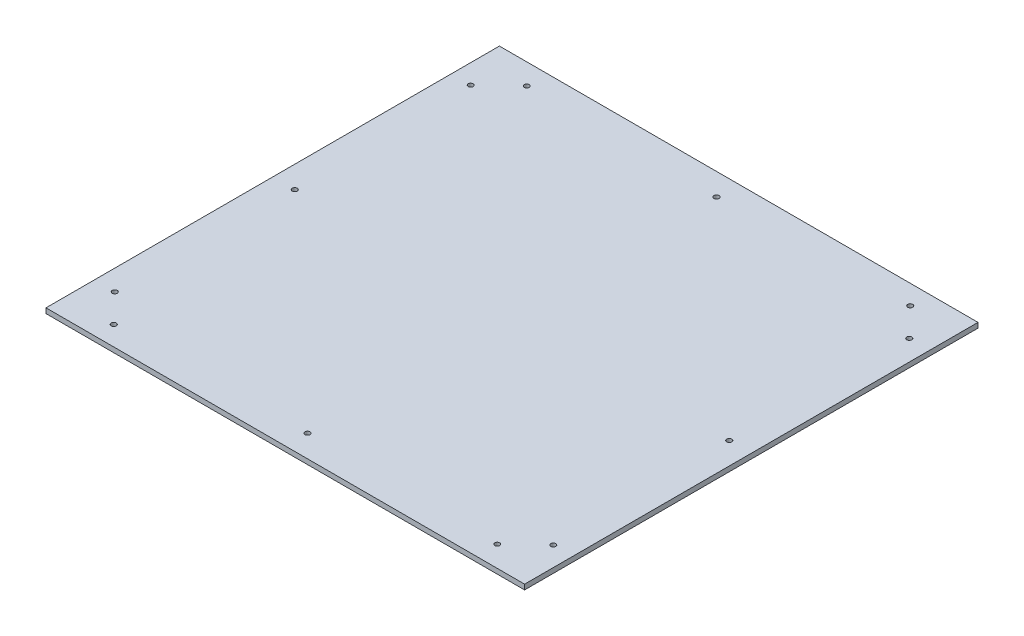
ISO-10303-21;
HEADER;
FILE_DESCRIPTION(('STEP AP214'),'2;1');
FILE_NAME('part.step','',(''),(''),'','','');
FILE_SCHEMA(('AUTOMOTIVE_DESIGN { 1 0 10303 214 1 1 1 1 }'));
ENDSEC;
DATA;
#1=APPLICATION_CONTEXT('core data for automotive mechanical design processes');
#2=APPLICATION_PROTOCOL_DEFINITION('international standard','automotive_design',2000,#1);
#3=PRODUCT_CONTEXT('',#1,'mechanical');
#4=PRODUCT('Part','Part','',(#3));
#5=PRODUCT_RELATED_PRODUCT_CATEGORY('part','',(#4));
#6=PRODUCT_DEFINITION_FORMATION('','',#4);
#7=PRODUCT_DEFINITION_CONTEXT('part definition',#1,'design');
#8=PRODUCT_DEFINITION('design','',#6,#7);
#9=PRODUCT_DEFINITION_SHAPE('','',#8);
#10=(LENGTH_UNIT() NAMED_UNIT(*) SI_UNIT(.MILLI.,.METRE.));
#11=(NAMED_UNIT(*) PLANE_ANGLE_UNIT() SI_UNIT($,.RADIAN.));
#12=(NAMED_UNIT(*) SI_UNIT($,.STERADIAN.) SOLID_ANGLE_UNIT());
#13=UNCERTAINTY_MEASURE_WITH_UNIT(LENGTH_MEASURE(1.E-05),#10,'distance_accuracy_value','');
#14=(GEOMETRIC_REPRESENTATION_CONTEXT(3) GLOBAL_UNCERTAINTY_ASSIGNED_CONTEXT((#13)) GLOBAL_UNIT_ASSIGNED_CONTEXT((#10,
#11,#12)) REPRESENTATION_CONTEXT('',''));
#15=CARTESIAN_POINT('',(0.,0.,0.));
#16=DIRECTION('',(0.,0.,1.));
#17=DIRECTION('',(1.,0.,0.));
#18=AXIS2_PLACEMENT_3D('',#15,#16,#17);
#19=CARTESIAN_POINT('',(241.3,5.08,-228.6));
#20=DIRECTION('',(-1.,0.,0.));
#21=DIRECTION('',(0.,0.,1.));
#22=AXIS2_PLACEMENT_3D('',#19,#20,#21);
#23=PLANE('',#22);
#24=DIRECTION('',(0.,0.,-1.));
#25=VECTOR('',#24,1.);
#26=CARTESIAN_POINT('',(241.3,0.,-228.6));
#27=LINE('',#26,#25);
#28=CARTESIAN_POINT('',(241.3,0.,228.6));
#29=VERTEX_POINT('',#28);
#30=CARTESIAN_POINT('',(241.3,0.,-228.6));
#31=VERTEX_POINT('',#30);
#32=EDGE_CURVE('E106',#29,#31,#27,.T.);
#33=ORIENTED_EDGE('',*,*,#32,.T.);
#34=DIRECTION('',(0.,-1.,0.));
#35=VECTOR('',#34,1.);
#36=CARTESIAN_POINT('',(241.3,5.08,-228.6));
#37=LINE('',#36,#35);
#38=CARTESIAN_POINT('',(241.3,5.08,-228.6));
#39=VERTEX_POINT('',#38);
#40=EDGE_CURVE('E11',#39,#31,#37,.T.);
#41=ORIENTED_EDGE('',*,*,#40,.F.);
#42=DIRECTION('',(0.,0.,-1.));
#43=VECTOR('',#42,1.);
#44=CARTESIAN_POINT('',(241.3,5.08,-228.6));
#45=LINE('',#44,#43);
#46=CARTESIAN_POINT('',(241.3,5.08,228.6));
#47=VERTEX_POINT('',#46);
#48=EDGE_CURVE('E94',#47,#39,#45,.T.);
#49=ORIENTED_EDGE('',*,*,#48,.F.);
#50=DIRECTION('',(0.,-1.,0.));
#51=VECTOR('',#50,1.);
#52=CARTESIAN_POINT('',(241.3,5.08,228.6));
#53=LINE('',#52,#51);
#54=EDGE_CURVE('E102',#47,#29,#53,.T.);
#55=ORIENTED_EDGE('',*,*,#54,.T.);
#56=EDGE_LOOP('',(#33,#41,#49,#55));
#57=FACE_BOUND('',#56,.T.);
#58=ADVANCED_FACE('F43',(#57),#23,.F.);
#59=CARTESIAN_POINT('',(-241.3,5.08,-228.6));
#60=DIRECTION('',(0.,0.,1.));
#61=DIRECTION('',(1.,0.,0.));
#62=AXIS2_PLACEMENT_3D('',#59,#60,#61);
#63=PLANE('',#62);
#64=DIRECTION('',(-1.,0.,0.));
#65=VECTOR('',#64,1.);
#66=CARTESIAN_POINT('',(-241.3,0.,-228.6));
#67=LINE('',#66,#65);
#68=CARTESIAN_POINT('',(-241.3,0.,-228.6));
#69=VERTEX_POINT('',#68);
#70=EDGE_CURVE('E98',#31,#69,#67,.T.);
#71=ORIENTED_EDGE('',*,*,#70,.T.);
#72=DIRECTION('',(0.,-1.,0.));
#73=VECTOR('',#72,1.);
#74=CARTESIAN_POINT('',(-241.3,5.08,-228.6));
#75=LINE('',#74,#73);
#76=CARTESIAN_POINT('',(-241.3,5.08,-228.6));
#77=VERTEX_POINT('',#76);
#78=EDGE_CURVE('E51',#77,#69,#75,.T.);
#79=ORIENTED_EDGE('',*,*,#78,.F.);
#80=DIRECTION('',(-1.,0.,0.));
#81=VECTOR('',#80,1.);
#82=CARTESIAN_POINT('',(-241.3,5.08,-228.6));
#83=LINE('',#82,#81);
#84=EDGE_CURVE('E89',#39,#77,#83,.T.);
#85=ORIENTED_EDGE('',*,*,#84,.F.);
#86=ORIENTED_EDGE('',*,*,#40,.T.);
#87=EDGE_LOOP('',(#71,#79,#85,#86));
#88=FACE_BOUND('',#87,.T.);
#89=ADVANCED_FACE('F97',(#88),#63,.F.);
#90=CARTESIAN_POINT('',(-241.3,5.08,-228.6));
#91=DIRECTION('',(1.,0.,0.));
#92=DIRECTION('',(0.,0.,-1.));
#93=AXIS2_PLACEMENT_3D('',#90,#91,#92);
#94=PLANE('',#93);
#95=DIRECTION('',(0.,0.,1.));
#96=VECTOR('',#95,1.);
#97=CARTESIAN_POINT('',(-241.3,0.,-228.6));
#98=LINE('',#97,#96);
#99=CARTESIAN_POINT('',(-241.3,0.,228.6));
#100=VERTEX_POINT('',#99);
#101=EDGE_CURVE('E76',#69,#100,#98,.T.);
#102=ORIENTED_EDGE('',*,*,#101,.T.);
#103=DIRECTION('',(0.,-1.,0.));
#104=VECTOR('',#103,1.);
#105=CARTESIAN_POINT('',(-241.3,5.08,228.6));
#106=LINE('',#105,#104);
#107=CARTESIAN_POINT('',(-241.3,5.08,228.6));
#108=VERTEX_POINT('',#107);
#109=EDGE_CURVE('E99',#108,#100,#106,.T.);
#110=ORIENTED_EDGE('',*,*,#109,.F.);
#111=DIRECTION('',(0.,0.,1.));
#112=VECTOR('',#111,1.);
#113=CARTESIAN_POINT('',(-241.3,5.08,-228.6));
#114=LINE('',#113,#112);
#115=EDGE_CURVE('E92',#77,#108,#114,.T.);
#116=ORIENTED_EDGE('',*,*,#115,.F.);
#117=ORIENTED_EDGE('',*,*,#78,.T.);
#118=EDGE_LOOP('',(#102,#110,#116,#117));
#119=FACE_BOUND('',#118,.T.);
#120=ADVANCED_FACE('F100',(#119),#94,.F.);
#121=CARTESIAN_POINT('',(-241.3,5.08,228.6));
#122=DIRECTION('',(0.,0.,-1.));
#123=DIRECTION('',(-1.,0.,0.));
#124=AXIS2_PLACEMENT_3D('',#121,#122,#123);
#125=PLANE('',#124);
#126=DIRECTION('',(1.,0.,0.));
#127=VECTOR('',#126,1.);
#128=CARTESIAN_POINT('',(-241.3,0.,228.6));
#129=LINE('',#128,#127);
#130=EDGE_CURVE('E82',#100,#29,#129,.T.);
#131=ORIENTED_EDGE('',*,*,#130,.T.);
#132=ORIENTED_EDGE('',*,*,#54,.F.);
#133=DIRECTION('',(1.,0.,0.));
#134=VECTOR('',#133,1.);
#135=CARTESIAN_POINT('',(-241.3,5.08,228.6));
#136=LINE('',#135,#134);
#137=EDGE_CURVE('E59',#108,#47,#136,.T.);
#138=ORIENTED_EDGE('',*,*,#137,.F.);
#139=ORIENTED_EDGE('',*,*,#109,.T.);
#140=EDGE_LOOP('',(#131,#132,#138,#139));
#141=FACE_BOUND('',#140,.T.);
#142=ADVANCED_FACE('F114',(#141),#125,.F.);
#143=CARTESIAN_POINT('',(0.,5.08,0.));
#144=DIRECTION('',(0.,1.,0.));
#145=DIRECTION('',(0.,0.,1.));
#146=AXIS2_PLACEMENT_3D('',#143,#144,#145);
#147=PLANE('',#146);
#148=CARTESIAN_POINT('',(-221.615,5.08,-179.959));
#149=DIRECTION('',(0.,1.,0.));
#150=DIRECTION('',(0.,0.,1.));
#151=AXIS2_PLACEMENT_3D('',#148,#149,#150);
#152=CIRCLE('',#151,2.47650000000001);
#153=CARTESIAN_POINT('',(-221.615,5.08,-177.4825));
#154=VERTEX_POINT('',#153);
#155=EDGE_CURVE('E130',#154,#154,#152,.T.);
#156=ORIENTED_EDGE('',*,*,#155,.F.);
#157=EDGE_LOOP('',(#156));
#158=FACE_BOUND('',#157,.T.);
#159=CARTESIAN_POINT('',(221.615,5.08,179.959));
#160=DIRECTION('',(0.,1.,0.));
#161=DIRECTION('',(0.,0.,1.));
#162=AXIS2_PLACEMENT_3D('',#159,#160,#161);
#163=CIRCLE('',#162,2.47650000000001);
#164=CARTESIAN_POINT('',(221.615,5.08,182.4355));
#165=VERTEX_POINT('',#164);
#166=EDGE_CURVE('E153',#165,#165,#163,.T.);
#167=ORIENTED_EDGE('',*,*,#166,.F.);
#168=EDGE_LOOP('',(#167));
#169=FACE_BOUND('',#168,.T.);
#170=CARTESIAN_POINT('',(-219.075,5.08,0.));
#171=DIRECTION('',(0.,1.,0.));
#172=DIRECTION('',(0.,0.,1.));
#173=AXIS2_PLACEMENT_3D('',#170,#171,#172);
#174=CIRCLE('',#173,2.53999999999998);
#175=CARTESIAN_POINT('',(-219.075,5.08,2.53999999999998));
#176=VERTEX_POINT('',#175);
#177=EDGE_CURVE('E154',#176,#176,#174,.T.);
#178=ORIENTED_EDGE('',*,*,#177,.F.);
#179=EDGE_LOOP('',(#178));
#180=FACE_BOUND('',#179,.T.);
#181=CARTESIAN_POINT('',(-192.659,5.08,208.915));
#182=DIRECTION('',(0.,1.,0.));
#183=DIRECTION('',(0.,0.,1.));
#184=AXIS2_PLACEMENT_3D('',#181,#182,#183);
#185=CIRCLE('',#184,2.53999999999998);
#186=CARTESIAN_POINT('',(-192.659,5.08,211.455));
#187=VERTEX_POINT('',#186);
#188=EDGE_CURVE('E165',#187,#187,#185,.T.);
#189=ORIENTED_EDGE('',*,*,#188,.F.);
#190=EDGE_LOOP('',(#189));
#191=FACE_BOUND('',#190,.T.);
#192=CARTESIAN_POINT('',(-220.6244,5.08,179.959));
#193=DIRECTION('',(0.,1.,0.));
#194=DIRECTION('',(0.,0.,1.));
#195=AXIS2_PLACEMENT_3D('',#192,#193,#194);
#196=CIRCLE('',#195,2.53999999999998);
#197=CARTESIAN_POINT('',(-220.6244,5.08,182.499));
#198=VERTEX_POINT('',#197);
#199=EDGE_CURVE('E129',#198,#198,#196,.T.);
#200=ORIENTED_EDGE('',*,*,#199,.F.);
#201=EDGE_LOOP('',(#200));
#202=FACE_BOUND('',#201,.T.);
#203=CARTESIAN_POINT('',(192.659,5.08,207.53832));
#204=DIRECTION('',(0.,1.,0.));
#205=DIRECTION('',(0.,0.,1.));
#206=AXIS2_PLACEMENT_3D('',#203,#204,#205);
#207=CIRCLE('',#206,2.47650000000001);
#208=CARTESIAN_POINT('',(192.659,5.08,210.01482));
#209=VERTEX_POINT('',#208);
#210=EDGE_CURVE('E136',#209,#209,#207,.T.);
#211=ORIENTED_EDGE('',*,*,#210,.F.);
#212=EDGE_LOOP('',(#211));
#213=FACE_BOUND('',#212,.T.);
#214=CARTESIAN_POINT('',(192.659,5.08,-208.915));
#215=DIRECTION('',(0.,1.,0.));
#216=DIRECTION('',(0.,0.,1.));
#217=AXIS2_PLACEMENT_3D('',#214,#215,#216);
#218=CIRCLE('',#217,2.53999999999998);
#219=CARTESIAN_POINT('',(192.659,5.08,-206.375));
#220=VERTEX_POINT('',#219);
#221=EDGE_CURVE('E142',#220,#220,#218,.T.);
#222=ORIENTED_EDGE('',*,*,#221,.F.);
#223=EDGE_LOOP('',(#222));
#224=FACE_BOUND('',#223,.T.);
#225=CARTESIAN_POINT('',(220.6244,5.08,-179.959));
#226=DIRECTION('',(0.,1.,0.));
#227=DIRECTION('',(0.,0.,1.));
#228=AXIS2_PLACEMENT_3D('',#225,#226,#227);
#229=CIRCLE('',#228,2.53999999999998);
#230=CARTESIAN_POINT('',(220.6244,5.08,-177.419));
#231=VERTEX_POINT('',#230);
#232=EDGE_CURVE('E123',#231,#231,#229,.T.);
#233=ORIENTED_EDGE('',*,*,#232,.F.);
#234=EDGE_LOOP('',(#233));
#235=FACE_BOUND('',#234,.T.);
#236=CARTESIAN_POINT('',(0.,5.08,206.248));
#237=DIRECTION('',(0.,1.,0.));
#238=DIRECTION('',(0.,0.,1.));
#239=AXIS2_PLACEMENT_3D('',#236,#237,#238);
#240=CIRCLE('',#239,2.54000000000001);
#241=CARTESIAN_POINT('',(0.,5.08,208.788));
#242=VERTEX_POINT('',#241);
#243=EDGE_CURVE('E166',#242,#242,#240,.T.);
#244=ORIENTED_EDGE('',*,*,#243,.F.);
#245=EDGE_LOOP('',(#244));
#246=FACE_BOUND('',#245,.T.);
#247=CARTESIAN_POINT('',(219.075,5.08,1.52979254861412E-12));
#248=DIRECTION('',(0.,1.,0.));
#249=DIRECTION('',(0.,0.,1.));
#250=AXIS2_PLACEMENT_3D('',#247,#248,#249);
#251=CIRCLE('',#250,2.53999999999998);
#252=CARTESIAN_POINT('',(219.075,5.08,2.54000000000151));
#253=VERTEX_POINT('',#252);
#254=EDGE_CURVE('E183',#253,#253,#251,.T.);
#255=ORIENTED_EDGE('',*,*,#254,.F.);
#256=EDGE_LOOP('',(#255));
#257=FACE_BOUND('',#256,.T.);
#258=CARTESIAN_POINT('',(0.,5.08,-206.248));
#259=DIRECTION('',(0.,1.,0.));
#260=DIRECTION('',(0.,0.,1.));
#261=AXIS2_PLACEMENT_3D('',#258,#259,#260);
#262=CIRCLE('',#261,2.54000000000001);
#263=CARTESIAN_POINT('',(0.,5.08,-203.708));
#264=VERTEX_POINT('',#263);
#265=EDGE_CURVE('E177',#264,#264,#262,.T.);
#266=ORIENTED_EDGE('',*,*,#265,.F.);
#267=EDGE_LOOP('',(#266));
#268=FACE_BOUND('',#267,.T.);
#269=CARTESIAN_POINT('',(-192.659,5.08,-207.53832));
#270=DIRECTION('',(0.,1.,0.));
#271=DIRECTION('',(0.,0.,1.));
#272=AXIS2_PLACEMENT_3D('',#269,#270,#271);
#273=CIRCLE('',#272,2.47650000000001);
#274=CARTESIAN_POINT('',(-192.659,5.08,-205.06182));
#275=VERTEX_POINT('',#274);
#276=EDGE_CURVE('E120',#275,#275,#273,.T.);
#277=ORIENTED_EDGE('',*,*,#276,.F.);
#278=EDGE_LOOP('',(#277));
#279=FACE_BOUND('',#278,.T.);
#280=ORIENTED_EDGE('',*,*,#48,.T.);
#281=ORIENTED_EDGE('',*,*,#84,.T.);
#282=ORIENTED_EDGE('',*,*,#115,.T.);
#283=ORIENTED_EDGE('',*,*,#137,.T.);
#284=EDGE_LOOP('',(#280,#281,#282,#283));
#285=FACE_BOUND('',#284,.T.);
#286=ADVANCED_FACE('F90',(#158,#169,#180,#191,#202,#213,#224,#235,#246,#257,#268,#279,#285),
#147,.T.);
#287=CARTESIAN_POINT('',(0.,0.,0.));
#288=DIRECTION('',(0.,1.,0.));
#289=DIRECTION('',(0.,0.,1.));
#290=AXIS2_PLACEMENT_3D('',#287,#288,#289);
#291=PLANE('',#290);
#292=CARTESIAN_POINT('',(-221.615,0.,-179.959));
#293=DIRECTION('',(0.,1.,0.));
#294=DIRECTION('',(0.,0.,1.));
#295=AXIS2_PLACEMENT_3D('',#292,#293,#294);
#296=CIRCLE('',#295,2.47650000000001);
#297=CARTESIAN_POINT('',(-221.615,0.,-177.4825));
#298=VERTEX_POINT('',#297);
#299=EDGE_CURVE('E157',#298,#298,#296,.T.);
#300=ORIENTED_EDGE('',*,*,#299,.T.);
#301=EDGE_LOOP('',(#300));
#302=FACE_BOUND('',#301,.T.);
#303=CARTESIAN_POINT('',(221.615,0.,179.959));
#304=DIRECTION('',(0.,1.,0.));
#305=DIRECTION('',(0.,0.,1.));
#306=AXIS2_PLACEMENT_3D('',#303,#304,#305);
#307=CIRCLE('',#306,2.47650000000001);
#308=CARTESIAN_POINT('',(221.615,0.,182.4355));
#309=VERTEX_POINT('',#308);
#310=EDGE_CURVE('E150',#309,#309,#307,.T.);
#311=ORIENTED_EDGE('',*,*,#310,.T.);
#312=EDGE_LOOP('',(#311));
#313=FACE_BOUND('',#312,.T.);
#314=CARTESIAN_POINT('',(-219.075,0.,0.));
#315=DIRECTION('',(0.,1.,0.));
#316=DIRECTION('',(0.,0.,1.));
#317=AXIS2_PLACEMENT_3D('',#314,#315,#316);
#318=CIRCLE('',#317,2.53999999999998);
#319=CARTESIAN_POINT('',(-219.075,0.,2.53999999999998));
#320=VERTEX_POINT('',#319);
#321=EDGE_CURVE('E169',#320,#320,#318,.T.);
#322=ORIENTED_EDGE('',*,*,#321,.T.);
#323=EDGE_LOOP('',(#322));
#324=FACE_BOUND('',#323,.T.);
#325=CARTESIAN_POINT('',(-192.659,0.,208.915));
#326=DIRECTION('',(0.,1.,0.));
#327=DIRECTION('',(0.,0.,1.));
#328=AXIS2_PLACEMENT_3D('',#325,#326,#327);
#329=CIRCLE('',#328,2.53999999999998);
#330=CARTESIAN_POINT('',(-192.659,0.,211.455));
#331=VERTEX_POINT('',#330);
#332=EDGE_CURVE('E162',#331,#331,#329,.T.);
#333=ORIENTED_EDGE('',*,*,#332,.T.);
#334=EDGE_LOOP('',(#333));
#335=FACE_BOUND('',#334,.T.);
#336=CARTESIAN_POINT('',(-220.6244,0.,179.959));
#337=DIRECTION('',(0.,1.,0.));
#338=DIRECTION('',(0.,0.,1.));
#339=AXIS2_PLACEMENT_3D('',#336,#337,#338);
#340=CIRCLE('',#339,2.53999999999998);
#341=CARTESIAN_POINT('',(-220.6244,0.,182.499));
#342=VERTEX_POINT('',#341);
#343=EDGE_CURVE('E126',#342,#342,#340,.T.);
#344=ORIENTED_EDGE('',*,*,#343,.T.);
#345=EDGE_LOOP('',(#344));
#346=FACE_BOUND('',#345,.T.);
#347=CARTESIAN_POINT('',(192.659,0.,207.53832));
#348=DIRECTION('',(0.,1.,0.));
#349=DIRECTION('',(0.,0.,1.));
#350=AXIS2_PLACEMENT_3D('',#347,#348,#349);
#351=CIRCLE('',#350,2.47650000000001);
#352=CARTESIAN_POINT('',(192.659,0.,210.01482));
#353=VERTEX_POINT('',#352);
#354=EDGE_CURVE('E133',#353,#353,#351,.T.);
#355=ORIENTED_EDGE('',*,*,#354,.T.);
#356=EDGE_LOOP('',(#355));
#357=FACE_BOUND('',#356,.T.);
#358=CARTESIAN_POINT('',(192.659,0.,-208.915));
#359=DIRECTION('',(0.,1.,0.));
#360=DIRECTION('',(0.,0.,1.));
#361=AXIS2_PLACEMENT_3D('',#358,#359,#360);
#362=CIRCLE('',#361,2.53999999999998);
#363=CARTESIAN_POINT('',(192.659,0.,-206.375));
#364=VERTEX_POINT('',#363);
#365=EDGE_CURVE('E139',#364,#364,#362,.T.);
#366=ORIENTED_EDGE('',*,*,#365,.T.);
#367=EDGE_LOOP('',(#366));
#368=FACE_BOUND('',#367,.T.);
#369=CARTESIAN_POINT('',(220.6244,0.,-179.959));
#370=DIRECTION('',(0.,1.,0.));
#371=DIRECTION('',(0.,0.,1.));
#372=AXIS2_PLACEMENT_3D('',#369,#370,#371);
#373=CIRCLE('',#372,2.53999999999998);
#374=CARTESIAN_POINT('',(220.6244,0.,-177.419));
#375=VERTEX_POINT('',#374);
#376=EDGE_CURVE('E145',#375,#375,#373,.T.);
#377=ORIENTED_EDGE('',*,*,#376,.T.);
#378=EDGE_LOOP('',(#377));
#379=FACE_BOUND('',#378,.T.);
#380=CARTESIAN_POINT('',(0.,0.,206.248));
#381=DIRECTION('',(0.,1.,0.));
#382=DIRECTION('',(0.,0.,1.));
#383=AXIS2_PLACEMENT_3D('',#380,#381,#382);
#384=CIRCLE('',#383,2.54000000000001);
#385=CARTESIAN_POINT('',(0.,0.,208.788));
#386=VERTEX_POINT('',#385);
#387=EDGE_CURVE('E186',#386,#386,#384,.T.);
#388=ORIENTED_EDGE('',*,*,#387,.T.);
#389=EDGE_LOOP('',(#388));
#390=FACE_BOUND('',#389,.T.);
#391=CARTESIAN_POINT('',(219.075,0.,1.52979254861412E-12));
#392=DIRECTION('',(0.,1.,0.));
#393=DIRECTION('',(0.,0.,1.));
#394=AXIS2_PLACEMENT_3D('',#391,#392,#393);
#395=CIRCLE('',#394,2.53999999999998);
#396=CARTESIAN_POINT('',(219.075,0.,2.54000000000151));
#397=VERTEX_POINT('',#396);
#398=EDGE_CURVE('E180',#397,#397,#395,.T.);
#399=ORIENTED_EDGE('',*,*,#398,.T.);
#400=EDGE_LOOP('',(#399));
#401=FACE_BOUND('',#400,.T.);
#402=CARTESIAN_POINT('',(0.,0.,-206.248));
#403=DIRECTION('',(0.,1.,0.));
#404=DIRECTION('',(0.,0.,1.));
#405=AXIS2_PLACEMENT_3D('',#402,#403,#404);
#406=CIRCLE('',#405,2.54000000000001);
#407=CARTESIAN_POINT('',(0.,0.,-203.708));
#408=VERTEX_POINT('',#407);
#409=EDGE_CURVE('E174',#408,#408,#406,.T.);
#410=ORIENTED_EDGE('',*,*,#409,.T.);
#411=EDGE_LOOP('',(#410));
#412=FACE_BOUND('',#411,.T.);
#413=CARTESIAN_POINT('',(-192.659,0.,-207.53832));
#414=DIRECTION('',(0.,1.,0.));
#415=DIRECTION('',(0.,0.,1.));
#416=AXIS2_PLACEMENT_3D('',#413,#414,#415);
#417=CIRCLE('',#416,2.47650000000001);
#418=CARTESIAN_POINT('',(-192.659,0.,-205.06182));
#419=VERTEX_POINT('',#418);
#420=EDGE_CURVE('E109',#419,#419,#417,.T.);
#421=ORIENTED_EDGE('',*,*,#420,.T.);
#422=EDGE_LOOP('',(#421));
#423=FACE_BOUND('',#422,.T.);
#424=ORIENTED_EDGE('',*,*,#32,.F.);
#425=ORIENTED_EDGE('',*,*,#130,.F.);
#426=ORIENTED_EDGE('',*,*,#101,.F.);
#427=ORIENTED_EDGE('',*,*,#70,.F.);
#428=EDGE_LOOP('',(#424,#425,#426,#427));
#429=FACE_BOUND('',#428,.T.);
#430=ADVANCED_FACE('F117',(#302,#313,#324,#335,#346,#357,#368,#379,#390,#401,#412,#423,#429),
#291,.F.);
#431=CARTESIAN_POINT('',(-192.659,0.,-207.53832));
#432=DIRECTION('',(0.,1.,0.));
#433=DIRECTION('',(0.,0.,1.));
#434=AXIS2_PLACEMENT_3D('',#431,#432,#433);
#435=CYLINDRICAL_SURFACE('',#434,2.47650000000001);
#436=ORIENTED_EDGE('',*,*,#420,.F.);
#437=EDGE_LOOP('',(#436));
#438=FACE_BOUND('',#437,.T.);
#439=ORIENTED_EDGE('',*,*,#276,.T.);
#440=EDGE_LOOP('',(#439));
#441=FACE_BOUND('',#440,.T.);
#442=ADVANCED_FACE('F204',(#438,#441),#435,.F.);
#443=CARTESIAN_POINT('',(0.,0.,-206.248));
#444=DIRECTION('',(0.,1.,0.));
#445=DIRECTION('',(0.,0.,1.));
#446=AXIS2_PLACEMENT_3D('',#443,#444,#445);
#447=CYLINDRICAL_SURFACE('',#446,2.54000000000001);
#448=ORIENTED_EDGE('',*,*,#409,.F.);
#449=EDGE_LOOP('',(#448));
#450=FACE_BOUND('',#449,.T.);
#451=ORIENTED_EDGE('',*,*,#265,.T.);
#452=EDGE_LOOP('',(#451));
#453=FACE_BOUND('',#452,.T.);
#454=ADVANCED_FACE('F206',(#450,#453),#447,.F.);
#455=CARTESIAN_POINT('',(219.075,0.,1.52979254861412E-12));
#456=DIRECTION('',(0.,1.,0.));
#457=DIRECTION('',(0.,0.,1.));
#458=AXIS2_PLACEMENT_3D('',#455,#456,#457);
#459=CYLINDRICAL_SURFACE('',#458,2.53999999999998);
#460=ORIENTED_EDGE('',*,*,#398,.F.);
#461=EDGE_LOOP('',(#460));
#462=FACE_BOUND('',#461,.T.);
#463=ORIENTED_EDGE('',*,*,#254,.T.);
#464=EDGE_LOOP('',(#463));
#465=FACE_BOUND('',#464,.T.);
#466=ADVANCED_FACE('F213',(#462,#465),#459,.F.);
#467=CARTESIAN_POINT('',(0.,0.,206.248));
#468=DIRECTION('',(0.,1.,0.));
#469=DIRECTION('',(0.,0.,1.));
#470=AXIS2_PLACEMENT_3D('',#467,#468,#469);
#471=CYLINDRICAL_SURFACE('',#470,2.54000000000001);
#472=ORIENTED_EDGE('',*,*,#387,.F.);
#473=EDGE_LOOP('',(#472));
#474=FACE_BOUND('',#473,.T.);
#475=ORIENTED_EDGE('',*,*,#243,.T.);
#476=EDGE_LOOP('',(#475));
#477=FACE_BOUND('',#476,.T.);
#478=ADVANCED_FACE('F192',(#474,#477),#471,.F.);
#479=CARTESIAN_POINT('',(220.6244,0.,-179.959));
#480=DIRECTION('',(0.,1.,0.));
#481=DIRECTION('',(0.,0.,1.));
#482=AXIS2_PLACEMENT_3D('',#479,#480,#481);
#483=CYLINDRICAL_SURFACE('',#482,2.53999999999998);
#484=ORIENTED_EDGE('',*,*,#376,.F.);
#485=EDGE_LOOP('',(#484));
#486=FACE_BOUND('',#485,.T.);
#487=ORIENTED_EDGE('',*,*,#232,.T.);
#488=EDGE_LOOP('',(#487));
#489=FACE_BOUND('',#488,.T.);
#490=ADVANCED_FACE('F273',(#486,#489),#483,.F.);
#491=CARTESIAN_POINT('',(192.659,0.,-208.915));
#492=DIRECTION('',(0.,1.,0.));
#493=DIRECTION('',(0.,0.,1.));
#494=AXIS2_PLACEMENT_3D('',#491,#492,#493);
#495=CYLINDRICAL_SURFACE('',#494,2.53999999999998);
#496=ORIENTED_EDGE('',*,*,#365,.F.);
#497=EDGE_LOOP('',(#496));
#498=FACE_BOUND('',#497,.T.);
#499=ORIENTED_EDGE('',*,*,#221,.T.);
#500=EDGE_LOOP('',(#499));
#501=FACE_BOUND('',#500,.T.);
#502=ADVANCED_FACE('F283',(#498,#501),#495,.F.);
#503=CARTESIAN_POINT('',(192.659,0.,207.53832));
#504=DIRECTION('',(0.,1.,0.));
#505=DIRECTION('',(0.,0.,1.));
#506=AXIS2_PLACEMENT_3D('',#503,#504,#505);
#507=CYLINDRICAL_SURFACE('',#506,2.47650000000001);
#508=ORIENTED_EDGE('',*,*,#354,.F.);
#509=EDGE_LOOP('',(#508));
#510=FACE_BOUND('',#509,.T.);
#511=ORIENTED_EDGE('',*,*,#210,.T.);
#512=EDGE_LOOP('',(#511));
#513=FACE_BOUND('',#512,.T.);
#514=ADVANCED_FACE('F293',(#510,#513),#507,.F.);
#515=CARTESIAN_POINT('',(-220.6244,0.,179.959));
#516=DIRECTION('',(0.,1.,0.));
#517=DIRECTION('',(0.,0.,1.));
#518=AXIS2_PLACEMENT_3D('',#515,#516,#517);
#519=CYLINDRICAL_SURFACE('',#518,2.53999999999998);
#520=ORIENTED_EDGE('',*,*,#343,.F.);
#521=EDGE_LOOP('',(#520));
#522=FACE_BOUND('',#521,.T.);
#523=ORIENTED_EDGE('',*,*,#199,.T.);
#524=EDGE_LOOP('',(#523));
#525=FACE_BOUND('',#524,.T.);
#526=ADVANCED_FACE('F303',(#522,#525),#519,.F.);
#527=CARTESIAN_POINT('',(-192.659,0.,208.915));
#528=DIRECTION('',(0.,1.,0.));
#529=DIRECTION('',(0.,0.,1.));
#530=AXIS2_PLACEMENT_3D('',#527,#528,#529);
#531=CYLINDRICAL_SURFACE('',#530,2.53999999999998);
#532=ORIENTED_EDGE('',*,*,#332,.F.);
#533=EDGE_LOOP('',(#532));
#534=FACE_BOUND('',#533,.T.);
#535=ORIENTED_EDGE('',*,*,#188,.T.);
#536=EDGE_LOOP('',(#535));
#537=FACE_BOUND('',#536,.T.);
#538=ADVANCED_FACE('F313',(#534,#537),#531,.F.);
#539=CARTESIAN_POINT('',(-219.075,0.,0.));
#540=DIRECTION('',(0.,1.,0.));
#541=DIRECTION('',(0.,0.,1.));
#542=AXIS2_PLACEMENT_3D('',#539,#540,#541);
#543=CYLINDRICAL_SURFACE('',#542,2.53999999999998);
#544=ORIENTED_EDGE('',*,*,#321,.F.);
#545=EDGE_LOOP('',(#544));
#546=FACE_BOUND('',#545,.T.);
#547=ORIENTED_EDGE('',*,*,#177,.T.);
#548=EDGE_LOOP('',(#547));
#549=FACE_BOUND('',#548,.T.);
#550=ADVANCED_FACE('F322',(#546,#549),#543,.F.);
#551=CARTESIAN_POINT('',(221.615,0.,179.959));
#552=DIRECTION('',(0.,1.,0.));
#553=DIRECTION('',(0.,0.,1.));
#554=AXIS2_PLACEMENT_3D('',#551,#552,#553);
#555=CYLINDRICAL_SURFACE('',#554,2.47650000000001);
#556=ORIENTED_EDGE('',*,*,#310,.F.);
#557=EDGE_LOOP('',(#556));
#558=FACE_BOUND('',#557,.T.);
#559=ORIENTED_EDGE('',*,*,#166,.T.);
#560=EDGE_LOOP('',(#559));
#561=FACE_BOUND('',#560,.T.);
#562=ADVANCED_FACE('F332',(#558,#561),#555,.F.);
#563=CARTESIAN_POINT('',(-221.615,0.,-179.959));
#564=DIRECTION('',(0.,1.,0.));
#565=DIRECTION('',(0.,0.,1.));
#566=AXIS2_PLACEMENT_3D('',#563,#564,#565);
#567=CYLINDRICAL_SURFACE('',#566,2.47650000000001);
#568=ORIENTED_EDGE('',*,*,#299,.F.);
#569=EDGE_LOOP('',(#568));
#570=FACE_BOUND('',#569,.T.);
#571=ORIENTED_EDGE('',*,*,#155,.T.);
#572=EDGE_LOOP('',(#571));
#573=FACE_BOUND('',#572,.T.);
#574=ADVANCED_FACE('F342',(#570,#573),#567,.F.);
#575=CLOSED_SHELL('',(#58,#89,#120,#142,#286,#430,#442,#454,#466,#478,#490,#502,#514,#526,#538,
#550,#562,#574));
#576=MANIFOLD_SOLID_BREP('B2',#575);
#577=ADVANCED_BREP_SHAPE_REPRESENTATION('',(#18,#576),#14);
#578=SHAPE_DEFINITION_REPRESENTATION(#9,#577);
ENDSEC;
END-ISO-10303-21;
